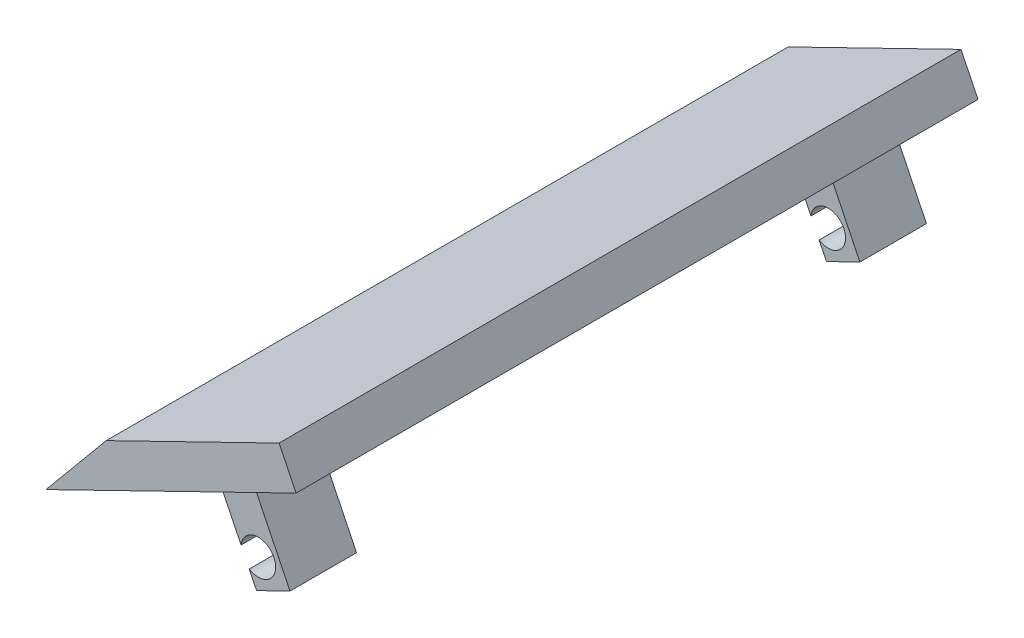
ISO-10303-21;
HEADER;
FILE_DESCRIPTION(('STEP AP214'),'2;1');
FILE_NAME('part.step','',(''),(''),'','','');
FILE_SCHEMA(('AUTOMOTIVE_DESIGN { 1 0 10303 214 1 1 1 1 }'));
ENDSEC;
DATA;
#1=APPLICATION_CONTEXT('core data for automotive mechanical design processes');
#2=APPLICATION_PROTOCOL_DEFINITION('international standard','automotive_design',2000,#1);
#3=PRODUCT_CONTEXT('',#1,'mechanical');
#4=PRODUCT('Part','Part','',(#3));
#5=PRODUCT_RELATED_PRODUCT_CATEGORY('part','',(#4));
#6=PRODUCT_DEFINITION_FORMATION('','',#4);
#7=PRODUCT_DEFINITION_CONTEXT('part definition',#1,'design');
#8=PRODUCT_DEFINITION('design','',#6,#7);
#9=PRODUCT_DEFINITION_SHAPE('','',#8);
#10=(LENGTH_UNIT() NAMED_UNIT(*) SI_UNIT(.MILLI.,.METRE.));
#11=(NAMED_UNIT(*) PLANE_ANGLE_UNIT() SI_UNIT($,.RADIAN.));
#12=(NAMED_UNIT(*) SI_UNIT($,.STERADIAN.) SOLID_ANGLE_UNIT());
#13=UNCERTAINTY_MEASURE_WITH_UNIT(LENGTH_MEASURE(1.E-05),#10,'distance_accuracy_value','');
#14=(GEOMETRIC_REPRESENTATION_CONTEXT(3) GLOBAL_UNCERTAINTY_ASSIGNED_CONTEXT((#13)) GLOBAL_UNIT_ASSIGNED_CONTEXT((#10,
#11,#12)) REPRESENTATION_CONTEXT('',''));
#15=CARTESIAN_POINT('',(0.,0.,0.));
#16=DIRECTION('',(0.,0.,1.));
#17=DIRECTION('',(1.,0.,0.));
#18=AXIS2_PLACEMENT_3D('',#15,#16,#17);
#19=CARTESIAN_POINT('',(30.2975866197176,-0.799306817319318,0.));
#20=DIRECTION('',(0.898794046299166,0.438371146789079,0.));
#21=DIRECTION('',(-0.438371146789079,0.898794046299167,0.));
#22=AXIS2_PLACEMENT_3D('',#19,#20,#21);
#23=PLANE('',#22);
#24=DIRECTION('',(-0.438371146789079,0.898794046299166,0.));
#25=VECTOR('',#24,1.);
#26=CARTESIAN_POINT('',(30.2975866197176,-0.799306817319323,106.333970482738));
#27=LINE('',#26,#25);
#28=CARTESIAN_POINT('',(30.2975866197176,-0.799306817319323,106.333970482738));
#29=VERTEX_POINT('',#28);
#30=CARTESIAN_POINT('',(29.1145818543532,1.62621239771407,106.333970482738));
#31=VERTEX_POINT('',#30);
#32=EDGE_CURVE('E203',#29,#31,#27,.T.);
#33=ORIENTED_EDGE('',*,*,#32,.T.);
#34=DIRECTION('',(0.,0.,-1.));
#35=VECTOR('',#34,1.);
#36=CARTESIAN_POINT('',(29.1145818543532,1.62621239771407,110.));
#37=LINE('',#36,#35);
#38=CARTESIAN_POINT('',(29.1145818543532,1.62621239771407,95.5969054227032));
#39=VERTEX_POINT('',#38);
#40=EDGE_CURVE('E295',#31,#39,#37,.T.);
#41=ORIENTED_EDGE('',*,*,#40,.T.);
#42=DIRECTION('',(-0.438371146789079,0.898794046299166,0.));
#43=VECTOR('',#42,1.);
#44=CARTESIAN_POINT('',(30.2975866197176,-0.799306817319321,95.5969054227032));
#45=LINE('',#44,#43);
#46=CARTESIAN_POINT('',(30.2975866197176,-0.799306817319321,95.5969054227032));
#47=VERTEX_POINT('',#46);
#48=EDGE_CURVE('E199',#47,#39,#45,.T.);
#49=ORIENTED_EDGE('',*,*,#48,.F.);
#50=DIRECTION('',(0.,0.,-1.));
#51=VECTOR('',#50,1.);
#52=CARTESIAN_POINT('',(30.2975866197176,-0.799306817319318,0.));
#53=LINE('',#52,#51);
#54=EDGE_CURVE('E181',#29,#47,#53,.T.);
#55=ORIENTED_EDGE('',*,*,#54,.F.);
#56=EDGE_LOOP('',(#33,#41,#49,#55));
#57=FACE_BOUND('',#56,.T.);
#58=ADVANCED_FACE('F35',(#57),#23,.F.);
#59=CARTESIAN_POINT('',(30.2975866197176,-0.799306817319311,0.));
#60=DIRECTION('',(-0.898794046299166,-0.438371146789079,0.));
#61=DIRECTION('',(0.438371146789079,-0.898794046299167,0.));
#62=AXIS2_PLACEMENT_3D('',#59,#60,#61);
#63=PLANE('',#62);
#64=DIRECTION('',(0.,0.,-1.));
#65=VECTOR('',#64,1.);
#66=CARTESIAN_POINT('',(27.7982737520538,4.32504395656025,110.));
#67=LINE('',#66,#65);
#68=CARTESIAN_POINT('',(27.7982737520539,4.32504395656031,14.4030945772968));
#69=VERTEX_POINT('',#68);
#70=CARTESIAN_POINT('',(27.7982737520539,4.32504395656032,3.66602951726237));
#71=VERTEX_POINT('',#70);
#72=EDGE_CURVE('E145',#69,#71,#67,.T.);
#73=ORIENTED_EDGE('',*,*,#72,.F.);
#74=DIRECTION('',(-0.438371146789079,0.898794046299166,0.));
#75=VECTOR('',#74,1.);
#76=CARTESIAN_POINT('',(30.2975866197176,-0.799306817319318,14.4030945772968));
#77=LINE('',#76,#75);
#78=CARTESIAN_POINT('',(24.1603905646705,11.783809830869,14.4030945772968));
#79=VERTEX_POINT('',#78);
#80=EDGE_CURVE('E313',#69,#79,#77,.T.);
#81=ORIENTED_EDGE('',*,*,#80,.T.);
#82=DIRECTION('',(0.,0.,1.));
#83=VECTOR('',#82,1.);
#84=CARTESIAN_POINT('',(24.1603905646705,11.783809830869,0.));
#85=LINE('',#84,#83);
#86=CARTESIAN_POINT('',(24.1603905646705,11.783809830869,3.66602951726236));
#87=VERTEX_POINT('',#86);
#88=EDGE_CURVE('E166',#87,#79,#85,.T.);
#89=ORIENTED_EDGE('',*,*,#88,.F.);
#90=DIRECTION('',(-0.438371146789079,0.898794046299166,0.));
#91=VECTOR('',#90,1.);
#92=CARTESIAN_POINT('',(30.2975866197176,-0.799306817319318,3.66602951726237));
#93=LINE('',#92,#91);
#94=EDGE_CURVE('E158',#71,#87,#93,.T.);
#95=ORIENTED_EDGE('',*,*,#94,.F.);
#96=EDGE_LOOP('',(#73,#81,#89,#95));
#97=FACE_BOUND('',#96,.T.);
#98=ADVANCED_FACE('F164',(#97),#63,.T.);
#99=CARTESIAN_POINT('',(0.,0.,110.));
#100=DIRECTION('',(-0.438371146789079,0.898794046299166,0.));
#101=DIRECTION('',(-0.898794046299166,-0.438371146789079,0.));
#102=AXIS2_PLACEMENT_3D('',#99,#100,#101);
#103=PLANE('',#102);
#104=DIRECTION('',(-0.898794046299166,-0.438371146789079,0.));
#105=VECTOR('',#104,1.);
#106=CARTESIAN_POINT('',(0.,0.,3.66602951726237));
#107=LINE('',#106,#105);
#108=CARTESIAN_POINT('',(29.5531548424655,14.4140367116035,3.66602951726237));
#109=VERTEX_POINT('',#108);
#110=EDGE_CURVE('E315',#109,#87,#107,.T.);
#111=ORIENTED_EDGE('',*,*,#110,.T.);
#112=ORIENTED_EDGE('',*,*,#88,.T.);
#113=DIRECTION('',(-0.898794046299166,-0.438371146789079,0.));
#114=VECTOR('',#113,1.);
#115=CARTESIAN_POINT('',(0.,0.,14.4030945772968));
#116=LINE('',#115,#114);
#117=CARTESIAN_POINT('',(29.5531548424655,14.4140367116035,14.4030945772968));
#118=VERTEX_POINT('',#117);
#119=EDGE_CURVE('E307',#118,#79,#116,.T.);
#120=ORIENTED_EDGE('',*,*,#119,.F.);
#121=DIRECTION('',(0.,0.,1.));
#122=VECTOR('',#121,1.);
#123=CARTESIAN_POINT('',(29.5531548424655,14.4140367116035,0.));
#124=LINE('',#123,#122);
#125=EDGE_CURVE('E317',#109,#118,#124,.T.);
#126=ORIENTED_EDGE('',*,*,#125,.F.);
#127=EDGE_LOOP('',(#111,#112,#120,#126));
#128=FACE_BOUND('',#127,.T.);
#129=DIRECTION('',(-0.898794046299166,-0.438371146789079,0.));
#130=VECTOR('',#129,1.);
#131=CARTESIAN_POINT('',(0.,0.,106.333970482738));
#132=LINE('',#131,#130);
#133=CARTESIAN_POINT('',(29.5531548424655,14.4140367116035,106.333970482738));
#134=VERTEX_POINT('',#133);
#135=CARTESIAN_POINT('',(24.1603905646705,11.783809830869,106.333970482738));
#136=VERTEX_POINT('',#135);
#137=EDGE_CURVE('E189',#134,#136,#132,.T.);
#138=ORIENTED_EDGE('',*,*,#137,.F.);
#139=DIRECTION('',(0.,0.,-1.));
#140=VECTOR('',#139,1.);
#141=CARTESIAN_POINT('',(29.5531548424655,14.4140367116035,0.));
#142=LINE('',#141,#140);
#143=CARTESIAN_POINT('',(29.5531548424655,14.4140367116035,95.5969054227032));
#144=VERTEX_POINT('',#143);
#145=EDGE_CURVE('E169',#134,#144,#142,.T.);
#146=ORIENTED_EDGE('',*,*,#145,.T.);
#147=DIRECTION('',(-0.898794046299166,-0.438371146789079,0.));
#148=VECTOR('',#147,1.);
#149=CARTESIAN_POINT('',(0.,0.,95.5969054227032));
#150=LINE('',#149,#148);
#151=CARTESIAN_POINT('',(24.1603905646705,11.783809830869,95.5969054227032));
#152=VERTEX_POINT('',#151);
#153=EDGE_CURVE('E179',#144,#152,#150,.T.);
#154=ORIENTED_EDGE('',*,*,#153,.T.);
#155=DIRECTION('',(0.,0.,-1.));
#156=VECTOR('',#155,1.);
#157=CARTESIAN_POINT('',(24.1603905646705,11.783809830869,0.));
#158=LINE('',#157,#156);
#159=EDGE_CURVE('E192',#136,#152,#158,.T.);
#160=ORIENTED_EDGE('',*,*,#159,.F.);
#161=EDGE_LOOP('',(#138,#146,#154,#160));
#162=FACE_BOUND('',#161,.T.);
#163=DIRECTION('',(0.898794046299166,0.438371146789078,0.));
#164=VECTOR('',#163,1.);
#165=CARTESIAN_POINT('',(0.,0.,0.));
#166=LINE('',#165,#164);
#167=CARTESIAN_POINT('',(0.,0.,0.));
#168=VERTEX_POINT('',#167);
#169=CARTESIAN_POINT('',(40.3386833980555,19.6744904730724,0.));
#170=VERTEX_POINT('',#169);
#171=EDGE_CURVE('E208',#168,#170,#166,.T.);
#172=ORIENTED_EDGE('',*,*,#171,.T.);
#173=DIRECTION('',(0.,0.,-1.));
#174=VECTOR('',#173,1.);
#175=CARTESIAN_POINT('',(40.3386833980555,19.6744904730724,110.));
#176=LINE('',#175,#174);
#177=CARTESIAN_POINT('',(40.3386833980555,19.6744904730724,110.));
#178=VERTEX_POINT('',#177);
#179=EDGE_CURVE('E43',#178,#170,#176,.T.);
#180=ORIENTED_EDGE('',*,*,#179,.F.);
#181=DIRECTION('',(0.898794046299166,0.438371146789078,0.));
#182=VECTOR('',#181,1.);
#183=CARTESIAN_POINT('',(0.,0.,110.));
#184=LINE('',#183,#182);
#185=CARTESIAN_POINT('',(0.,0.,110.));
#186=VERTEX_POINT('',#185);
#187=EDGE_CURVE('E209',#186,#178,#184,.T.);
#188=ORIENTED_EDGE('',*,*,#187,.F.);
#189=DIRECTION('',(0.,0.,-1.));
#190=VECTOR('',#189,1.);
#191=CARTESIAN_POINT('',(0.,0.,110.));
#192=LINE('',#191,#190);
#193=EDGE_CURVE('E219',#186,#168,#192,.T.);
#194=ORIENTED_EDGE('',*,*,#193,.T.);
#195=EDGE_LOOP('',(#172,#180,#188,#194));
#196=FACE_BOUND('',#195,.T.);
#197=ADVANCED_FACE('F37',(#128,#162,#196),#103,.F.);
#198=CARTESIAN_POINT('',(37.5978401557718,25.2940519018934,110.));
#199=DIRECTION('',(-0.898794046299167,-0.438371146789078,0.));
#200=DIRECTION('',(0.438371146789078,-0.898794046299167,0.));
#201=AXIS2_PLACEMENT_3D('',#198,#199,#200);
#202=PLANE('',#201);
#203=DIRECTION('',(-0.438371146789078,0.898794046299167,0.));
#204=VECTOR('',#203,1.);
#205=CARTESIAN_POINT('',(37.5978401557718,25.2940519018934,0.));
#206=LINE('',#205,#204);
#207=CARTESIAN_POINT('',(37.5978401557718,25.2940519018934,0.));
#208=VERTEX_POINT('',#207);
#209=EDGE_CURVE('E222',#170,#208,#206,.T.);
#210=ORIENTED_EDGE('',*,*,#209,.T.);
#211=DIRECTION('',(0.,0.,-1.));
#212=VECTOR('',#211,1.);
#213=CARTESIAN_POINT('',(37.5978401557718,25.2940519018934,110.));
#214=LINE('',#213,#212);
#215=CARTESIAN_POINT('',(37.5978401557718,25.2940519018934,110.));
#216=VERTEX_POINT('',#215);
#217=EDGE_CURVE('E233',#216,#208,#214,.T.);
#218=ORIENTED_EDGE('',*,*,#217,.F.);
#219=DIRECTION('',(-0.438371146789078,0.898794046299167,0.));
#220=VECTOR('',#219,1.);
#221=CARTESIAN_POINT('',(37.5978401557718,25.2940519018934,110.));
#222=LINE('',#221,#220);
#223=EDGE_CURVE('E212',#178,#216,#222,.T.);
#224=ORIENTED_EDGE('',*,*,#223,.F.);
#225=ORIENTED_EDGE('',*,*,#179,.T.);
#226=EDGE_LOOP('',(#210,#218,#224,#225));
#227=FACE_BOUND('',#226,.T.);
#228=ADVANCED_FACE('F238',(#227),#202,.F.);
#229=CARTESIAN_POINT('',(9.7171598636265,11.6957355320282,110.));
#230=DIRECTION('',(0.438371146789078,-0.898794046299167,0.));
#231=DIRECTION('',(0.898794046299167,0.438371146789078,0.));
#232=AXIS2_PLACEMENT_3D('',#229,#230,#231);
#233=PLANE('',#232);
#234=DIRECTION('',(-0.898794046299167,-0.438371146789078,0.));
#235=VECTOR('',#234,1.);
#236=CARTESIAN_POINT('',(9.7171598636265,11.6957355320282,0.));
#237=LINE('',#236,#235);
#238=CARTESIAN_POINT('',(9.7171598636265,11.6957355320282,0.));
#239=VERTEX_POINT('',#238);
#240=EDGE_CURVE('E225',#208,#239,#237,.T.);
#241=ORIENTED_EDGE('',*,*,#240,.T.);
#242=DIRECTION('',(0.,0.,-1.));
#243=VECTOR('',#242,1.);
#244=CARTESIAN_POINT('',(9.7171598636265,11.6957355320282,110.));
#245=LINE('',#244,#243);
#246=CARTESIAN_POINT('',(9.7171598636265,11.6957355320282,110.));
#247=VERTEX_POINT('',#246);
#248=EDGE_CURVE('E230',#247,#239,#245,.T.);
#249=ORIENTED_EDGE('',*,*,#248,.F.);
#250=DIRECTION('',(-0.898794046299167,-0.438371146789078,0.));
#251=VECTOR('',#250,1.);
#252=CARTESIAN_POINT('',(18.0787580389921,15.7739594546468,110.));
#253=LINE('',#252,#251);
#254=EDGE_CURVE('E215',#216,#247,#253,.T.);
#255=ORIENTED_EDGE('',*,*,#254,.F.);
#256=ORIENTED_EDGE('',*,*,#217,.T.);
#257=EDGE_LOOP('',(#241,#249,#255,#256));
#258=FACE_BOUND('',#257,.T.);
#259=ADVANCED_FACE('F249',(#258),#233,.F.);
#260=CARTESIAN_POINT('',(0.,0.,110.));
#261=DIRECTION('',(0.769167659168876,-0.639047034332115,0.));
#262=DIRECTION('',(0.639047034332115,0.769167659168876,0.));
#263=AXIS2_PLACEMENT_3D('',#260,#261,#262);
#264=PLANE('',#263);
#265=DIRECTION('',(-0.639047034332115,-0.769167659168876,0.));
#266=VECTOR('',#265,1.);
#267=CARTESIAN_POINT('',(0.,0.,0.));
#268=LINE('',#267,#266);
#269=EDGE_CURVE('E213',#239,#168,#268,.T.);
#270=ORIENTED_EDGE('',*,*,#269,.T.);
#271=ORIENTED_EDGE('',*,*,#193,.F.);
#272=DIRECTION('',(-0.639047034332115,-0.769167659168876,0.));
#273=VECTOR('',#272,1.);
#274=CARTESIAN_POINT('',(0.,0.,110.));
#275=LINE('',#274,#273);
#276=EDGE_CURVE('E217',#247,#186,#275,.T.);
#277=ORIENTED_EDGE('',*,*,#276,.F.);
#278=ORIENTED_EDGE('',*,*,#248,.T.);
#279=EDGE_LOOP('',(#270,#271,#277,#278));
#280=FACE_BOUND('',#279,.T.);
#281=ADVANCED_FACE('F253',(#280),#264,.F.);
#282=CARTESIAN_POINT('',(0.,0.,110.));
#283=DIRECTION('',(0.,0.,-1.));
#284=DIRECTION('',(-1.,0.,0.));
#285=AXIS2_PLACEMENT_3D('',#282,#283,#284);
#286=PLANE('',#285);
#287=ORIENTED_EDGE('',*,*,#187,.T.);
#288=ORIENTED_EDGE('',*,*,#223,.T.);
#289=ORIENTED_EDGE('',*,*,#254,.T.);
#290=ORIENTED_EDGE('',*,*,#276,.T.);
#291=EDGE_LOOP('',(#287,#288,#289,#290));
#292=FACE_BOUND('',#291,.T.);
#293=ADVANCED_FACE('F255',(#292),#286,.F.);
#294=CARTESIAN_POINT('',(0.,0.,0.));
#295=DIRECTION('',(0.,0.,-1.));
#296=DIRECTION('',(-1.,0.,0.));
#297=AXIS2_PLACEMENT_3D('',#294,#295,#296);
#298=PLANE('',#297);
#299=ORIENTED_EDGE('',*,*,#171,.F.);
#300=ORIENTED_EDGE('',*,*,#269,.F.);
#301=ORIENTED_EDGE('',*,*,#240,.F.);
#302=ORIENTED_EDGE('',*,*,#209,.F.);
#303=EDGE_LOOP('',(#299,#300,#301,#302));
#304=FACE_BOUND('',#303,.T.);
#305=ADVANCED_FACE('F246',(#304),#298,.T.);
#306=CARTESIAN_POINT('',(35.6903508975126,1.83092006341516,0.));
#307=DIRECTION('',(0.898794046299166,0.438371146789079,0.));
#308=DIRECTION('',(-0.438371146789079,0.898794046299167,0.));
#309=AXIS2_PLACEMENT_3D('',#306,#307,#308);
#310=PLANE('',#309);
#311=ORIENTED_EDGE('',*,*,#145,.F.);
#312=DIRECTION('',(-0.438371146789079,0.898794046299166,0.));
#313=VECTOR('',#312,1.);
#314=CARTESIAN_POINT('',(35.6903508975126,1.83092006341516,106.333970482738));
#315=LINE('',#314,#313);
#316=CARTESIAN_POINT('',(35.6903508975126,1.83092006341516,106.333970482738));
#317=VERTEX_POINT('',#316);
#318=EDGE_CURVE('E206',#317,#134,#315,.T.);
#319=ORIENTED_EDGE('',*,*,#318,.F.);
#320=DIRECTION('',(0.,0.,-1.));
#321=VECTOR('',#320,1.);
#322=CARTESIAN_POINT('',(35.6903508975126,1.83092006341516,0.));
#323=LINE('',#322,#321);
#324=CARTESIAN_POINT('',(35.6903508975126,1.83092006341516,95.5969054227032));
#325=VERTEX_POINT('',#324);
#326=EDGE_CURVE('E175',#317,#325,#323,.T.);
#327=ORIENTED_EDGE('',*,*,#326,.T.);
#328=DIRECTION('',(-0.438371146789079,0.898794046299166,0.));
#329=VECTOR('',#328,1.);
#330=CARTESIAN_POINT('',(35.6903508975126,1.83092006341516,95.5969054227032));
#331=LINE('',#330,#329);
#332=EDGE_CURVE('E186',#325,#144,#331,.T.);
#333=ORIENTED_EDGE('',*,*,#332,.T.);
#334=EDGE_LOOP('',(#311,#319,#327,#333));
#335=FACE_BOUND('',#334,.T.);
#336=ADVANCED_FACE('F262',(#335),#310,.T.);
#337=CARTESIAN_POINT('',(6.1371960550471,-12.5831166481883,106.333970482738));
#338=DIRECTION('',(0.,0.,-1.));
#339=DIRECTION('',(-1.,0.,0.));
#340=AXIS2_PLACEMENT_3D('',#337,#338,#339);
#341=PLANE('',#340);
#342=CARTESIAN_POINT('',(27.7982737520538,4.32504395656029,106.333970482738));
#343=VERTEX_POINT('',#342);
#344=EDGE_CURVE('E202',#343,#136,#27,.T.);
#345=ORIENTED_EDGE('',*,*,#344,.F.);
#346=CARTESIAN_POINT('',(30.5806853293807,4.0116977991601,106.333970482738));
#347=DIRECTION('',(0.,0.,-1.));
#348=DIRECTION('',(-1.,0.,0.));
#349=AXIS2_PLACEMENT_3D('',#346,#347,#348);
#350=CIRCLE('',#349,2.8);
#351=EDGE_CURVE('E300',#343,#31,#350,.T.);
#352=ORIENTED_EDGE('',*,*,#351,.T.);
#353=ORIENTED_EDGE('',*,*,#32,.F.);
#354=DIRECTION('',(-0.898794046299166,-0.438371146789079,0.));
#355=VECTOR('',#354,1.);
#356=CARTESIAN_POINT('',(6.1371960550471,-12.5831166481883,106.333970482738));
#357=LINE('',#356,#355);
#358=EDGE_CURVE('E178',#317,#29,#357,.T.);
#359=ORIENTED_EDGE('',*,*,#358,.F.);
#360=ORIENTED_EDGE('',*,*,#318,.T.);
#361=ORIENTED_EDGE('',*,*,#137,.T.);
#362=EDGE_LOOP('',(#345,#352,#353,#359,#360,#361));
#363=FACE_BOUND('',#362,.T.);
#364=ADVANCED_FACE('F279',(#363),#341,.F.);
#365=CARTESIAN_POINT('',(27.7982737520539,4.32504395656029,95.5969054227032));
#366=VERTEX_POINT('',#365);
#367=EDGE_CURVE('E198',#366,#152,#45,.T.);
#368=ORIENTED_EDGE('',*,*,#367,.F.);
#369=DIRECTION('',(0.,0.,-1.));
#370=VECTOR('',#369,1.);
#371=CARTESIAN_POINT('',(27.7982737520538,4.32504395656029,110.));
#372=LINE('',#371,#370);
#373=EDGE_CURVE('E50',#366,#343,#372,.F.);
#374=ORIENTED_EDGE('',*,*,#373,.T.);
#375=ORIENTED_EDGE('',*,*,#344,.T.);
#376=ORIENTED_EDGE('',*,*,#159,.T.);
#377=EDGE_LOOP('',(#368,#374,#375,#376));
#378=FACE_BOUND('',#377,.T.);
#379=ADVANCED_FACE('F269',(#378),#23,.F.);
#380=CARTESIAN_POINT('',(6.1371960550471,-12.5831166481883,95.5969054227032));
#381=DIRECTION('',(0.,0.,-1.));
#382=DIRECTION('',(-1.,0.,0.));
#383=AXIS2_PLACEMENT_3D('',#380,#381,#382);
#384=PLANE('',#383);
#385=CARTESIAN_POINT('',(30.5806853293807,4.0116977991601,95.5969054227032));
#386=DIRECTION('',(0.,0.,-1.));
#387=DIRECTION('',(-1.,0.,0.));
#388=AXIS2_PLACEMENT_3D('',#385,#386,#387);
#389=CIRCLE('',#388,2.8);
#390=EDGE_CURVE('E152',#366,#39,#389,.T.);
#391=ORIENTED_EDGE('',*,*,#390,.F.);
#392=ORIENTED_EDGE('',*,*,#367,.T.);
#393=ORIENTED_EDGE('',*,*,#153,.F.);
#394=ORIENTED_EDGE('',*,*,#332,.F.);
#395=DIRECTION('',(-0.898794046299166,-0.438371146789079,0.));
#396=VECTOR('',#395,1.);
#397=CARTESIAN_POINT('',(6.1371960550471,-12.5831166481883,95.5969054227032));
#398=LINE('',#397,#396);
#399=EDGE_CURVE('E183',#325,#47,#398,.T.);
#400=ORIENTED_EDGE('',*,*,#399,.T.);
#401=ORIENTED_EDGE('',*,*,#48,.T.);
#402=EDGE_LOOP('',(#391,#392,#393,#394,#400,#401));
#403=FACE_BOUND('',#402,.T.);
#404=ADVANCED_FACE('F278',(#403),#384,.T.);
#405=CARTESIAN_POINT('',(6.1371960550471,-12.5831166481883,0.));
#406=DIRECTION('',(0.438371146789079,-0.898794046299166,0.));
#407=DIRECTION('',(0.898794046299166,0.438371146789079,0.));
#408=AXIS2_PLACEMENT_3D('',#405,#406,#407);
#409=PLANE('',#408);
#410=ORIENTED_EDGE('',*,*,#326,.F.);
#411=ORIENTED_EDGE('',*,*,#358,.T.);
#412=ORIENTED_EDGE('',*,*,#54,.T.);
#413=ORIENTED_EDGE('',*,*,#399,.F.);
#414=EDGE_LOOP('',(#410,#411,#412,#413));
#415=FACE_BOUND('',#414,.T.);
#416=ADVANCED_FACE('F285',(#415),#409,.T.);
#417=DIRECTION('',(0.,0.,-1.));
#418=VECTOR('',#417,1.);
#419=CARTESIAN_POINT('',(29.1145818543531,1.62621239771409,110.));
#420=LINE('',#419,#418);
#421=CARTESIAN_POINT('',(29.1145818543532,1.62621239771406,3.66602951726237));
#422=VERTEX_POINT('',#421);
#423=CARTESIAN_POINT('',(29.1145818543532,1.62621239771406,14.4030945772968));
#424=VERTEX_POINT('',#423);
#425=EDGE_CURVE('E58',#422,#424,#420,.F.);
#426=ORIENTED_EDGE('',*,*,#425,.F.);
#427=CARTESIAN_POINT('',(30.2975866197176,-0.799306817319318,3.66602951726237));
#428=VERTEX_POINT('',#427);
#429=EDGE_CURVE('E161',#428,#422,#93,.T.);
#430=ORIENTED_EDGE('',*,*,#429,.F.);
#431=DIRECTION('',(0.,0.,1.));
#432=VECTOR('',#431,1.);
#433=CARTESIAN_POINT('',(30.2975866197176,-0.799306817319311,0.));
#434=LINE('',#433,#432);
#435=CARTESIAN_POINT('',(30.2975866197176,-0.799306817319318,14.4030945772968));
#436=VERTEX_POINT('',#435);
#437=EDGE_CURVE('E303',#428,#436,#434,.T.);
#438=ORIENTED_EDGE('',*,*,#437,.T.);
#439=EDGE_CURVE('E322',#436,#424,#77,.T.);
#440=ORIENTED_EDGE('',*,*,#439,.T.);
#441=EDGE_LOOP('',(#426,#430,#438,#440));
#442=FACE_BOUND('',#441,.T.);
#443=ADVANCED_FACE('F274',(#442),#63,.T.);
#444=CARTESIAN_POINT('',(6.1371960550471,-12.5831166481883,3.66602951726237));
#445=DIRECTION('',(0.,0.,-1.));
#446=DIRECTION('',(-1.,0.,0.));
#447=AXIS2_PLACEMENT_3D('',#444,#445,#446);
#448=PLANE('',#447);
#449=CARTESIAN_POINT('',(30.5806853293807,4.0116977991601,3.66602951726237));
#450=DIRECTION('',(0.,0.,-1.));
#451=DIRECTION('',(-1.,0.,0.));
#452=AXIS2_PLACEMENT_3D('',#449,#450,#451);
#453=CIRCLE('',#452,2.8);
#454=EDGE_CURVE('E148',#71,#422,#453,.T.);
#455=ORIENTED_EDGE('',*,*,#454,.F.);
#456=ORIENTED_EDGE('',*,*,#94,.T.);
#457=ORIENTED_EDGE('',*,*,#110,.F.);
#458=DIRECTION('',(-0.438371146789079,0.898794046299166,0.));
#459=VECTOR('',#458,1.);
#460=CARTESIAN_POINT('',(35.6903508975126,1.83092006341516,3.66602951726237));
#461=LINE('',#460,#459);
#462=CARTESIAN_POINT('',(35.6903508975126,1.83092006341516,3.66602951726237));
#463=VERTEX_POINT('',#462);
#464=EDGE_CURVE('E167',#463,#109,#461,.T.);
#465=ORIENTED_EDGE('',*,*,#464,.F.);
#466=DIRECTION('',(-0.898794046299166,-0.438371146789079,0.));
#467=VECTOR('',#466,1.);
#468=CARTESIAN_POINT('',(6.1371960550471,-12.5831166481883,3.66602951726237));
#469=LINE('',#468,#467);
#470=EDGE_CURVE('E306',#463,#428,#469,.T.);
#471=ORIENTED_EDGE('',*,*,#470,.T.);
#472=ORIENTED_EDGE('',*,*,#429,.T.);
#473=EDGE_LOOP('',(#455,#456,#457,#465,#471,#472));
#474=FACE_BOUND('',#473,.T.);
#475=ADVANCED_FACE('F156',(#474),#448,.T.);
#476=CARTESIAN_POINT('',(35.6903508975126,1.83092006341516,0.));
#477=DIRECTION('',(-0.898794046299166,-0.438371146789079,0.));
#478=DIRECTION('',(0.438371146789079,-0.898794046299167,0.));
#479=AXIS2_PLACEMENT_3D('',#476,#477,#478);
#480=PLANE('',#479);
#481=ORIENTED_EDGE('',*,*,#125,.T.);
#482=DIRECTION('',(-0.438371146789079,0.898794046299166,0.));
#483=VECTOR('',#482,1.);
#484=CARTESIAN_POINT('',(35.6903508975126,1.83092006341515,14.4030945772968));
#485=LINE('',#484,#483);
#486=CARTESIAN_POINT('',(35.6903508975126,1.83092006341515,14.4030945772968));
#487=VERTEX_POINT('',#486);
#488=EDGE_CURVE('E171',#487,#118,#485,.T.);
#489=ORIENTED_EDGE('',*,*,#488,.F.);
#490=DIRECTION('',(0.,0.,1.));
#491=VECTOR('',#490,1.);
#492=CARTESIAN_POINT('',(35.6903508975126,1.83092006341516,0.));
#493=LINE('',#492,#491);
#494=EDGE_CURVE('E309',#463,#487,#493,.T.);
#495=ORIENTED_EDGE('',*,*,#494,.F.);
#496=ORIENTED_EDGE('',*,*,#464,.T.);
#497=EDGE_LOOP('',(#481,#489,#495,#496));
#498=FACE_BOUND('',#497,.T.);
#499=ADVANCED_FACE('F332',(#498),#480,.F.);
#500=CARTESIAN_POINT('',(6.1371960550471,-12.5831166481883,14.4030945772968));
#501=DIRECTION('',(0.,0.,-1.));
#502=DIRECTION('',(-1.,0.,0.));
#503=AXIS2_PLACEMENT_3D('',#500,#501,#502);
#504=PLANE('',#503);
#505=ORIENTED_EDGE('',*,*,#80,.F.);
#506=CARTESIAN_POINT('',(30.5806853293807,4.0116977991601,14.4030945772968));
#507=DIRECTION('',(0.,0.,-1.));
#508=DIRECTION('',(-1.,0.,0.));
#509=AXIS2_PLACEMENT_3D('',#506,#507,#508);
#510=CIRCLE('',#509,2.8);
#511=EDGE_CURVE('E11',#69,#424,#510,.T.);
#512=ORIENTED_EDGE('',*,*,#511,.T.);
#513=ORIENTED_EDGE('',*,*,#439,.F.);
#514=DIRECTION('',(-0.898794046299166,-0.438371146789079,0.));
#515=VECTOR('',#514,1.);
#516=CARTESIAN_POINT('',(6.1371960550471,-12.5831166481883,14.4030945772968));
#517=LINE('',#516,#515);
#518=EDGE_CURVE('E311',#487,#436,#517,.T.);
#519=ORIENTED_EDGE('',*,*,#518,.F.);
#520=ORIENTED_EDGE('',*,*,#488,.T.);
#521=ORIENTED_EDGE('',*,*,#119,.T.);
#522=EDGE_LOOP('',(#505,#512,#513,#519,#520,#521));
#523=FACE_BOUND('',#522,.T.);
#524=ADVANCED_FACE('F328',(#523),#504,.F.);
#525=CARTESIAN_POINT('',(6.1371960550471,-12.5831166481883,0.));
#526=DIRECTION('',(0.438371146789079,-0.898794046299166,0.));
#527=DIRECTION('',(0.898794046299166,0.438371146789079,0.));
#528=AXIS2_PLACEMENT_3D('',#525,#526,#527);
#529=PLANE('',#528);
#530=ORIENTED_EDGE('',*,*,#437,.F.);
#531=ORIENTED_EDGE('',*,*,#470,.F.);
#532=ORIENTED_EDGE('',*,*,#494,.T.);
#533=ORIENTED_EDGE('',*,*,#518,.T.);
#534=EDGE_LOOP('',(#530,#531,#532,#533));
#535=FACE_BOUND('',#534,.T.);
#536=ADVANCED_FACE('F338',(#535),#529,.T.);
#537=CARTESIAN_POINT('',(30.5806853293807,4.0116977991601,110.));
#538=DIRECTION('',(0.,0.,-1.));
#539=DIRECTION('',(-1.,0.,0.));
#540=AXIS2_PLACEMENT_3D('',#537,#538,#539);
#541=CYLINDRICAL_SURFACE('',#540,2.8);
#542=ORIENTED_EDGE('',*,*,#72,.T.);
#543=ORIENTED_EDGE('',*,*,#454,.T.);
#544=ORIENTED_EDGE('',*,*,#425,.T.);
#545=ORIENTED_EDGE('',*,*,#511,.F.);
#546=EDGE_LOOP('',(#542,#543,#544,#545));
#547=FACE_BOUND('',#546,.T.);
#548=ADVANCED_FACE('F147',(#547),#541,.F.);
#549=ORIENTED_EDGE('',*,*,#373,.F.);
#550=ORIENTED_EDGE('',*,*,#390,.T.);
#551=ORIENTED_EDGE('',*,*,#40,.F.);
#552=ORIENTED_EDGE('',*,*,#351,.F.);
#553=EDGE_LOOP('',(#549,#550,#551,#552));
#554=FACE_BOUND('',#553,.T.);
#555=ADVANCED_FACE('F356',(#554),#541,.F.);
#556=CLOSED_SHELL('',(#58,#98,#197,#228,#259,#281,#293,#305,#336,#364,#379,#404,#416,#443,#475,
#499,#524,#536,#548,#555));
#557=MANIFOLD_SOLID_BREP('B2',#556);
#558=ADVANCED_BREP_SHAPE_REPRESENTATION('',(#18,#557),#14);
#559=SHAPE_DEFINITION_REPRESENTATION(#9,#558);
ENDSEC;
END-ISO-10303-21;
